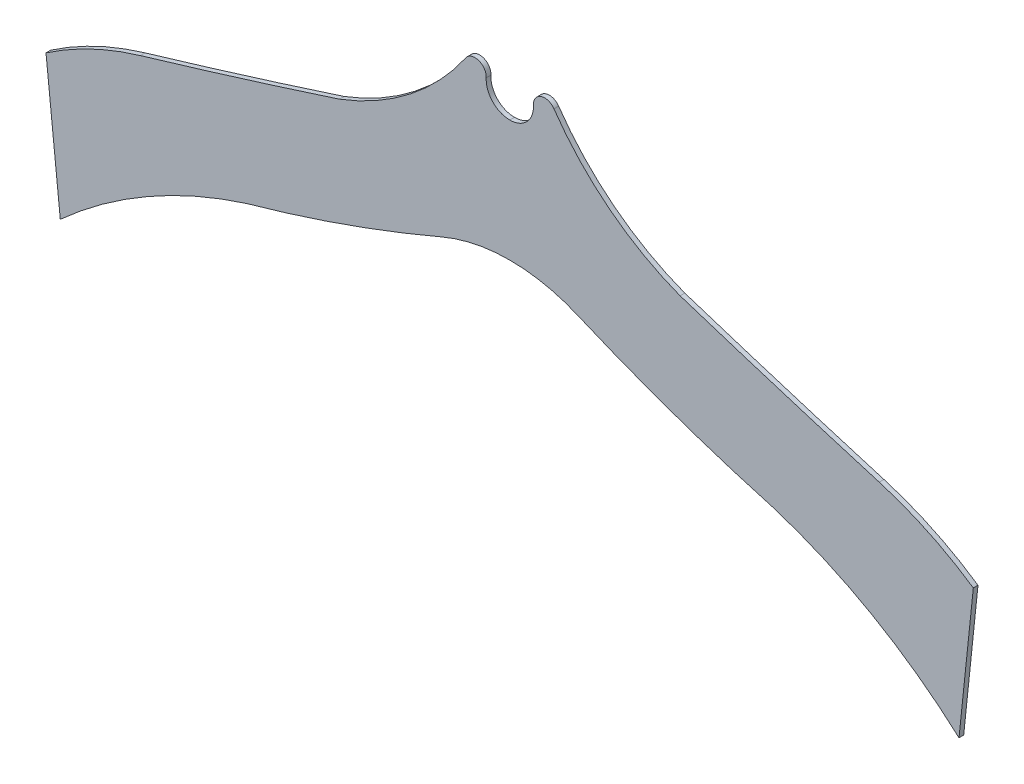
ISO-10303-21;
HEADER;
FILE_DESCRIPTION(('STEP AP214'),'2;1');
FILE_NAME('part.step','',(''),(''),'','','');
FILE_SCHEMA(('AUTOMOTIVE_DESIGN { 1 0 10303 214 1 1 1 1 }'));
ENDSEC;
DATA;
#1=APPLICATION_CONTEXT('core data for automotive mechanical design processes');
#2=APPLICATION_PROTOCOL_DEFINITION('international standard','automotive_design',2000,#1);
#3=PRODUCT_CONTEXT('',#1,'mechanical');
#4=PRODUCT('Part','Part','',(#3));
#5=PRODUCT_RELATED_PRODUCT_CATEGORY('part','',(#4));
#6=PRODUCT_DEFINITION_FORMATION('','',#4);
#7=PRODUCT_DEFINITION_CONTEXT('part definition',#1,'design');
#8=PRODUCT_DEFINITION('design','',#6,#7);
#9=PRODUCT_DEFINITION_SHAPE('','',#8);
#10=(LENGTH_UNIT() NAMED_UNIT(*) SI_UNIT(.MILLI.,.METRE.));
#11=(NAMED_UNIT(*) PLANE_ANGLE_UNIT() SI_UNIT($,.RADIAN.));
#12=(NAMED_UNIT(*) SI_UNIT($,.STERADIAN.) SOLID_ANGLE_UNIT());
#13=UNCERTAINTY_MEASURE_WITH_UNIT(LENGTH_MEASURE(1.E-05),#10,'distance_accuracy_value','');
#14=(GEOMETRIC_REPRESENTATION_CONTEXT(3) GLOBAL_UNCERTAINTY_ASSIGNED_CONTEXT((#13)) GLOBAL_UNIT_ASSIGNED_CONTEXT((#10,
#11,#12)) REPRESENTATION_CONTEXT('',''));
#15=CARTESIAN_POINT('',(0.,0.,0.));
#16=DIRECTION('',(0.,0.,1.));
#17=DIRECTION('',(1.,0.,0.));
#18=AXIS2_PLACEMENT_3D('',#15,#16,#17);
#19=CARTESIAN_POINT('',(-741.128045107195,819.426514046939,0.));
#20=DIRECTION('',(-0.994599825520508,-0.103784329619531,0.));
#21=DIRECTION('',(0.103784329619531,-0.994599825520508,0.));
#22=AXIS2_PLACEMENT_3D('',#19,#20,#21);
#23=PLANE('',#22);
#24=DIRECTION('',(0.,0.,-1.));
#25=VECTOR('',#24,1.);
#26=CARTESIAN_POINT('',(-608.406270583659,-452.490491803614,6.35));
#27=LINE('',#26,#25);
#28=CARTESIAN_POINT('',(-608.406270583659,-452.490491803614,6.35));
#29=VERTEX_POINT('',#28);
#30=CARTESIAN_POINT('',(-608.406270583659,-452.490491803614,0.));
#31=VERTEX_POINT('',#30);
#32=EDGE_CURVE('E252',#29,#31,#27,.T.);
#33=ORIENTED_EDGE('',*,*,#32,.F.);
#34=DIRECTION('',(0.103784329619531,-0.994599825520508,0.));
#35=VECTOR('',#34,1.);
#36=CARTESIAN_POINT('',(-433.648459855304,-2127.25284461701,6.35));
#37=LINE('',#36,#35);
#38=CARTESIAN_POINT('',(-627.762456318267,-266.993711846947,6.35));
#39=VERTEX_POINT('',#38);
#40=EDGE_CURVE('E255',#39,#29,#37,.T.);
#41=ORIENTED_EDGE('',*,*,#40,.F.);
#42=DIRECTION('',(0.,0.,-1.));
#43=VECTOR('',#42,1.);
#44=CARTESIAN_POINT('',(-627.762456318268,-266.993711846947,6.35));
#45=LINE('',#44,#43);
#46=CARTESIAN_POINT('',(-627.762456318267,-266.993711846947,0.));
#47=VERTEX_POINT('',#46);
#48=EDGE_CURVE('E248',#39,#47,#45,.T.);
#49=ORIENTED_EDGE('',*,*,#48,.T.);
#50=DIRECTION('',(0.103784329619531,-0.994599825520508,0.));
#51=VECTOR('',#50,1.);
#52=CARTESIAN_POINT('',(-433.648459855304,-2127.25284461701,0.));
#53=LINE('',#52,#51);
#54=EDGE_CURVE('E243',#47,#31,#53,.T.);
#55=ORIENTED_EDGE('',*,*,#54,.T.);
#56=EDGE_LOOP('',(#33,#41,#49,#55));
#57=FACE_BOUND('',#56,.T.);
#58=ADVANCED_FACE('F36',(#57),#23,.T.);
#59=CARTESIAN_POINT('',(741.128045107195,819.426514046939,0.));
#60=DIRECTION('',(0.994599825520508,-0.103784329619531,0.));
#61=DIRECTION('',(-0.103784329619531,-0.994599825520508,0.));
#62=AXIS2_PLACEMENT_3D('',#59,#60,#61);
#63=PLANE('',#62);
#64=DIRECTION('',(0.,0.,-1.));
#65=VECTOR('',#64,1.);
#66=CARTESIAN_POINT('',(608.451430094389,-452.057713159115,6.35));
#67=LINE('',#66,#65);
#68=CARTESIAN_POINT('',(608.451430094389,-452.057713159115,0.));
#69=VERTEX_POINT('',#68);
#70=CARTESIAN_POINT('',(608.451430094389,-452.057713159115,6.35));
#71=VERTEX_POINT('',#70);
#72=EDGE_CURVE('E251',#69,#71,#67,.F.);
#73=ORIENTED_EDGE('',*,*,#72,.F.);
#74=DIRECTION('',(0.103784329619531,0.994599825520508,0.));
#75=VECTOR('',#74,1.);
#76=CARTESIAN_POINT('',(429.370376525692,-2168.25114319246,0.));
#77=LINE('',#76,#75);
#78=CARTESIAN_POINT('',(627.797282319719,-266.659962666374,0.));
#79=VERTEX_POINT('',#78);
#80=EDGE_CURVE('E247',#69,#79,#77,.T.);
#81=ORIENTED_EDGE('',*,*,#80,.T.);
#82=DIRECTION('',(0.,0.,-1.));
#83=VECTOR('',#82,1.);
#84=CARTESIAN_POINT('',(627.797282319719,-266.659962666374,6.35));
#85=LINE('',#84,#83);
#86=CARTESIAN_POINT('',(627.797282319719,-266.659962666374,6.35));
#87=VERTEX_POINT('',#86);
#88=EDGE_CURVE('E246',#79,#87,#85,.F.);
#89=ORIENTED_EDGE('',*,*,#88,.T.);
#90=DIRECTION('',(0.103784329619531,0.994599825520508,0.));
#91=VECTOR('',#90,1.);
#92=CARTESIAN_POINT('',(429.370376525692,-2168.25114319246,6.35));
#93=LINE('',#92,#91);
#94=EDGE_CURVE('E40',#71,#87,#93,.T.);
#95=ORIENTED_EDGE('',*,*,#94,.F.);
#96=EDGE_LOOP('',(#73,#81,#89,#95));
#97=FACE_BOUND('',#96,.T.);
#98=ADVANCED_FACE('F373',(#97),#63,.T.);
#99=CARTESIAN_POINT('',(-149.626818853529,-960.302602730689,6.35));
#100=DIRECTION('',(0.,0.,-1.));
#101=DIRECTION('',(-1.,0.,0.));
#102=AXIS2_PLACEMENT_3D('',#99,#100,#101);
#103=CYLINDRICAL_SURFACE('',#102,684.362276381457);
#104=CARTESIAN_POINT('',(-149.626818853529,-960.302602730689,6.35));
#105=DIRECTION('',(0.,0.,1.));
#106=DIRECTION('',(1.,0.,0.));
#107=AXIS2_PLACEMENT_3D('',#104,#105,#106);
#108=CIRCLE('',#107,684.362276381457);
#109=CARTESIAN_POINT('',(-356.494214289515,-307.954838083993,6.35));
#110=VERTEX_POINT('',#109);
#111=EDGE_CURVE('E195',#110,#29,#108,.T.);
#112=ORIENTED_EDGE('',*,*,#111,.T.);
#113=ORIENTED_EDGE('',*,*,#32,.T.);
#114=CARTESIAN_POINT('',(-149.626818853529,-960.302602730689,0.));
#115=DIRECTION('',(0.,0.,1.));
#116=DIRECTION('',(1.,0.,0.));
#117=AXIS2_PLACEMENT_3D('',#114,#115,#116);
#118=CIRCLE('',#117,684.362276381457);
#119=CARTESIAN_POINT('',(-356.494214289515,-307.954838083993,0.));
#120=VERTEX_POINT('',#119);
#121=EDGE_CURVE('E234',#120,#31,#118,.T.);
#122=ORIENTED_EDGE('',*,*,#121,.F.);
#123=DIRECTION('',(0.,0.,-1.));
#124=VECTOR('',#123,1.);
#125=CARTESIAN_POINT('',(-356.494214289515,-307.954838083993,6.35));
#126=LINE('',#125,#124);
#127=EDGE_CURVE('E294',#110,#120,#126,.T.);
#128=ORIENTED_EDGE('',*,*,#127,.F.);
#129=EDGE_LOOP('',(#112,#113,#122,#128));
#130=FACE_BOUND('',#129,.T.);
#131=ADVANCED_FACE('F375',(#130),#103,.F.);
#132=CARTESIAN_POINT('',(-931.247662145724,1749.97689497029,6.35));
#133=DIRECTION('',(0.,0.,-1.));
#134=DIRECTION('',(-1.,0.,0.));
#135=AXIS2_PLACEMENT_3D('',#132,#133,#134);
#136=CYLINDRICAL_SURFACE('',#135,2136.68541056806);
#137=CARTESIAN_POINT('',(-931.247662145724,1749.97689497029,0.));
#138=DIRECTION('',(0.,0.,1.));
#139=DIRECTION('',(1.,0.,0.));
#140=AXIS2_PLACEMENT_3D('',#137,#138,#139);
#141=CIRCLE('',#140,2136.68541056806);
#142=CARTESIAN_POINT('',(-91.4193635317043,-214.740126023188,0.));
#143=VERTEX_POINT('',#142);
#144=EDGE_CURVE('E238',#120,#143,#141,.T.);
#145=ORIENTED_EDGE('',*,*,#144,.T.);
#146=DIRECTION('',(0.,0.,-1.));
#147=VECTOR('',#146,1.);
#148=CARTESIAN_POINT('',(-91.4193635317043,-214.740126023188,6.35));
#149=LINE('',#148,#147);
#150=CARTESIAN_POINT('',(-91.4193635317043,-214.740126023188,6.35));
#151=VERTEX_POINT('',#150);
#152=EDGE_CURVE('E297',#151,#143,#149,.T.);
#153=ORIENTED_EDGE('',*,*,#152,.F.);
#154=CARTESIAN_POINT('',(-931.247662145724,1749.97689497029,6.35));
#155=DIRECTION('',(0.,0.,1.));
#156=DIRECTION('',(1.,0.,0.));
#157=AXIS2_PLACEMENT_3D('',#154,#155,#156);
#158=CIRCLE('',#157,2136.68541056806);
#159=EDGE_CURVE('E192',#110,#151,#158,.T.);
#160=ORIENTED_EDGE('',*,*,#159,.F.);
#161=ORIENTED_EDGE('',*,*,#127,.T.);
#162=EDGE_LOOP('',(#145,#153,#160,#161));
#163=FACE_BOUND('',#162,.T.);
#164=ADVANCED_FACE('F381',(#163),#136,.T.);
#165=CARTESIAN_POINT('',(-0.156347124893763,-428.243293300525,6.35));
#166=DIRECTION('',(0.,0.,-1.));
#167=DIRECTION('',(-1.,0.,0.));
#168=AXIS2_PLACEMENT_3D('',#165,#166,#167);
#169=CYLINDRICAL_SURFACE('',#168,232.190741850594);
#170=CARTESIAN_POINT('',(-0.156347124893763,-428.243293300525,0.));
#171=DIRECTION('',(0.,0.,1.));
#172=DIRECTION('',(1.,0.,0.));
#173=AXIS2_PLACEMENT_3D('',#170,#171,#172);
#174=CIRCLE('',#173,232.190741850594);
#175=CARTESIAN_POINT('',(0.262323317295323,-196.052928909171,0.));
#176=VERTEX_POINT('',#175);
#177=EDGE_CURVE('E228',#176,#143,#174,.T.);
#178=ORIENTED_EDGE('',*,*,#177,.F.);
#179=DIRECTION('',(0.,0.,-1.));
#180=VECTOR('',#179,1.);
#181=CARTESIAN_POINT('',(0.262323317295323,-196.052928909171,6.35));
#182=LINE('',#181,#180);
#183=CARTESIAN_POINT('',(0.262323317295323,-196.052928909171,6.35));
#184=VERTEX_POINT('',#183);
#185=EDGE_CURVE('E118',#184,#176,#182,.T.);
#186=ORIENTED_EDGE('',*,*,#185,.F.);
#187=CARTESIAN_POINT('',(-0.156347124893763,-428.243293300525,6.35));
#188=DIRECTION('',(0.,0.,1.));
#189=DIRECTION('',(1.,0.,0.));
#190=AXIS2_PLACEMENT_3D('',#187,#188,#189);
#191=CIRCLE('',#190,232.190741850594);
#192=EDGE_CURVE('E189',#184,#151,#191,.T.);
#193=ORIENTED_EDGE('',*,*,#192,.T.);
#194=ORIENTED_EDGE('',*,*,#152,.T.);
#195=EDGE_LOOP('',(#178,#186,#193,#194));
#196=FACE_BOUND('',#195,.T.);
#197=ADVANCED_FACE('F418',(#196),#169,.F.);
#198=CARTESIAN_POINT('',(0.680993759012427,-428.243293300527,6.35));
#199=DIRECTION('',(0.,0.,-1.));
#200=DIRECTION('',(-1.,0.,0.));
#201=AXIS2_PLACEMENT_3D('',#198,#199,#200);
#202=CYLINDRICAL_SURFACE('',#201,232.19074185057);
#203=CARTESIAN_POINT('',(0.680993759012427,-428.243293300527,0.));
#204=DIRECTION('',(0.,0.,1.));
#205=DIRECTION('',(1.,0.,0.));
#206=AXIS2_PLACEMENT_3D('',#203,#204,#205);
#207=CIRCLE('',#206,232.19074185057);
#208=CARTESIAN_POINT('',(91.9440101658601,-214.740126023264,0.));
#209=VERTEX_POINT('',#208);
#210=EDGE_CURVE('E309',#209,#176,#207,.T.);
#211=ORIENTED_EDGE('',*,*,#210,.F.);
#212=DIRECTION('',(0.,0.,-1.));
#213=VECTOR('',#212,1.);
#214=CARTESIAN_POINT('',(91.9440101658601,-214.740126023264,6.35));
#215=LINE('',#214,#213);
#216=CARTESIAN_POINT('',(91.9440101658601,-214.740126023264,6.35));
#217=VERTEX_POINT('',#216);
#218=EDGE_CURVE('E295',#217,#209,#215,.T.);
#219=ORIENTED_EDGE('',*,*,#218,.F.);
#220=CARTESIAN_POINT('',(0.680993759012427,-428.243293300527,6.35));
#221=DIRECTION('',(0.,0.,1.));
#222=DIRECTION('',(1.,0.,0.));
#223=AXIS2_PLACEMENT_3D('',#220,#221,#222);
#224=CIRCLE('',#223,232.19074185057);
#225=EDGE_CURVE('E199',#217,#184,#224,.T.);
#226=ORIENTED_EDGE('',*,*,#225,.T.);
#227=ORIENTED_EDGE('',*,*,#185,.T.);
#228=EDGE_LOOP('',(#211,#219,#226,#227));
#229=FACE_BOUND('',#228,.T.);
#230=ADVANCED_FACE('F415',(#229),#202,.F.);
#231=CARTESIAN_POINT('',(931.772308779785,1749.9768949703,6.35));
#232=DIRECTION('',(0.,0.,-1.));
#233=DIRECTION('',(-1.,0.,0.));
#234=AXIS2_PLACEMENT_3D('',#231,#232,#233);
#235=CYLINDRICAL_SURFACE('',#234,2136.68541056811);
#236=CARTESIAN_POINT('',(931.772308779785,1749.9768949703,0.));
#237=DIRECTION('',(0.,0.,1.));
#238=DIRECTION('',(1.,0.,0.));
#239=AXIS2_PLACEMENT_3D('',#236,#237,#238);
#240=CIRCLE('',#239,2136.68541056811);
#241=CARTESIAN_POINT('',(357.018860927798,-307.954838085206,0.));
#242=VERTEX_POINT('',#241);
#243=EDGE_CURVE('E262',#209,#242,#240,.T.);
#244=ORIENTED_EDGE('',*,*,#243,.T.);
#245=DIRECTION('',(0.,0.,-1.));
#246=VECTOR('',#245,1.);
#247=CARTESIAN_POINT('',(357.018860927798,-307.954838085206,6.35));
#248=LINE('',#247,#246);
#249=CARTESIAN_POINT('',(357.018860927798,-307.954838085206,6.35));
#250=VERTEX_POINT('',#249);
#251=EDGE_CURVE('E291',#250,#242,#248,.T.);
#252=ORIENTED_EDGE('',*,*,#251,.F.);
#253=CARTESIAN_POINT('',(931.772308779785,1749.9768949703,6.35));
#254=DIRECTION('',(0.,0.,1.));
#255=DIRECTION('',(1.,0.,0.));
#256=AXIS2_PLACEMENT_3D('',#253,#254,#255);
#257=CIRCLE('',#256,2136.68541056811);
#258=EDGE_CURVE('E196',#217,#250,#257,.T.);
#259=ORIENTED_EDGE('',*,*,#258,.F.);
#260=ORIENTED_EDGE('',*,*,#218,.T.);
#261=EDGE_LOOP('',(#244,#252,#259,#260));
#262=FACE_BOUND('',#261,.T.);
#263=ADVANCED_FACE('F292',(#262),#235,.T.);
#264=CARTESIAN_POINT('',(150.151465487733,-960.302602730623,6.35));
#265=DIRECTION('',(0.,0.,-1.));
#266=DIRECTION('',(-1.,0.,0.));
#267=AXIS2_PLACEMENT_3D('',#264,#265,#266);
#268=CYLINDRICAL_SURFACE('',#267,684.362276381462);
#269=CARTESIAN_POINT('',(150.151465487733,-960.302602730623,0.));
#270=DIRECTION('',(0.,0.,1.));
#271=DIRECTION('',(1.,0.,0.));
#272=AXIS2_PLACEMENT_3D('',#269,#270,#271);
#273=CIRCLE('',#272,684.362276381462);
#274=EDGE_CURVE('E237',#69,#242,#273,.T.);
#275=ORIENTED_EDGE('',*,*,#274,.F.);
#276=ORIENTED_EDGE('',*,*,#72,.T.);
#277=CARTESIAN_POINT('',(150.151465487733,-960.302602730623,6.35));
#278=DIRECTION('',(0.,0.,1.));
#279=DIRECTION('',(1.,0.,0.));
#280=AXIS2_PLACEMENT_3D('',#277,#278,#279);
#281=CIRCLE('',#280,684.362276381462);
#282=EDGE_CURVE('E200',#71,#250,#281,.T.);
#283=ORIENTED_EDGE('',*,*,#282,.T.);
#284=ORIENTED_EDGE('',*,*,#251,.T.);
#285=EDGE_LOOP('',(#275,#276,#283,#284));
#286=FACE_BOUND('',#285,.T.);
#287=ADVANCED_FACE('F274',(#286),#268,.F.);
#288=CARTESIAN_POINT('',(370.600209775842,-644.656663544559,6.35));
#289=DIRECTION('',(0.,0.,-1.));
#290=DIRECTION('',(-1.,0.,0.));
#291=AXIS2_PLACEMENT_3D('',#288,#289,#290);
#292=CYLINDRICAL_SURFACE('',#291,457.199999999926);
#293=ORIENTED_EDGE('',*,*,#88,.F.);
#294=CARTESIAN_POINT('',(370.600209775842,-644.656663544559,0.));
#295=DIRECTION('',(0.,0.,1.));
#296=DIRECTION('',(1.,0.,0.));
#297=AXIS2_PLACEMENT_3D('',#294,#295,#296);
#298=CIRCLE('',#297,457.199999999926);
#299=CARTESIAN_POINT('',(500.458599124062,-206.286228049988,0.));
#300=VERTEX_POINT('',#299);
#301=EDGE_CURVE('E233',#79,#300,#298,.T.);
#302=ORIENTED_EDGE('',*,*,#301,.T.);
#303=DIRECTION('',(0.,0.,-1.));
#304=VECTOR('',#303,1.);
#305=CARTESIAN_POINT('',(500.458599124062,-206.286228049988,6.35));
#306=LINE('',#305,#304);
#307=CARTESIAN_POINT('',(500.458599124062,-206.286228049988,6.35));
#308=VERTEX_POINT('',#307);
#309=EDGE_CURVE('E338',#308,#300,#306,.T.);
#310=ORIENTED_EDGE('',*,*,#309,.F.);
#311=CARTESIAN_POINT('',(370.600209775842,-644.656663544559,6.35));
#312=DIRECTION('',(0.,0.,1.));
#313=DIRECTION('',(1.,0.,0.));
#314=AXIS2_PLACEMENT_3D('',#311,#312,#313);
#315=CIRCLE('',#314,457.199999999926);
#316=EDGE_CURVE('E213',#87,#308,#315,.T.);
#317=ORIENTED_EDGE('',*,*,#316,.F.);
#318=EDGE_LOOP('',(#293,#302,#310,#317));
#319=FACE_BOUND('',#318,.T.);
#320=ADVANCED_FACE('F372',(#319),#292,.T.);
#321=CARTESIAN_POINT('',(3590.22888950069,10224.029090722,6.35));
#322=DIRECTION('',(0.,0.,-1.));
#323=DIRECTION('',(-1.,0.,0.));
#324=AXIS2_PLACEMENT_3D('',#321,#322,#323);
#325=CYLINDRICAL_SURFACE('',#324,10878.334343837);
#326=CARTESIAN_POINT('',(3590.22888950069,10224.029090722,0.));
#327=DIRECTION('',(0.,0.,1.));
#328=DIRECTION('',(1.,0.,0.));
#329=AXIS2_PLACEMENT_3D('',#326,#327,#328);
#330=CIRCLE('',#329,10878.334343837);
#331=CARTESIAN_POINT('',(230.806507684277,-122.585783566876,0.));
#332=VERTEX_POINT('',#331);
#333=EDGE_CURVE('E260',#332,#300,#330,.T.);
#334=ORIENTED_EDGE('',*,*,#333,.F.);
#335=DIRECTION('',(0.,0.,-1.));
#336=VECTOR('',#335,1.);
#337=CARTESIAN_POINT('',(230.806507684277,-122.585783566876,6.35));
#338=LINE('',#337,#336);
#339=CARTESIAN_POINT('',(230.806507684277,-122.585783566876,6.35));
#340=VERTEX_POINT('',#339);
#341=EDGE_CURVE('E341',#340,#332,#338,.T.);
#342=ORIENTED_EDGE('',*,*,#341,.F.);
#343=CARTESIAN_POINT('',(3590.22888950069,10224.029090722,6.35));
#344=DIRECTION('',(0.,0.,1.));
#345=DIRECTION('',(1.,0.,0.));
#346=AXIS2_PLACEMENT_3D('',#343,#344,#345);
#347=CIRCLE('',#346,10878.334343837);
#348=EDGE_CURVE('E210',#340,#308,#347,.T.);
#349=ORIENTED_EDGE('',*,*,#348,.T.);
#350=ORIENTED_EDGE('',*,*,#309,.T.);
#351=EDGE_LOOP('',(#334,#342,#349,#350));
#352=FACE_BOUND('',#351,.T.);
#353=ADVANCED_FACE('F363',(#352),#325,.F.);
#354=CARTESIAN_POINT('',(359.750331869882,217.914087955783,6.35));
#355=DIRECTION('',(0.,0.,-1.));
#356=DIRECTION('',(-1.,0.,0.));
#357=AXIS2_PLACEMENT_3D('',#354,#355,#356);
#358=CYLINDRICAL_SURFACE('',#357,364.097064397059);
#359=CARTESIAN_POINT('',(359.750331869882,217.914087955783,0.));
#360=DIRECTION('',(0.,0.,1.));
#361=DIRECTION('',(1.,0.,0.));
#362=AXIS2_PLACEMENT_3D('',#359,#360,#361);
#363=CIRCLE('',#362,364.097064397059);
#364=CARTESIAN_POINT('',(59.9897816229322,11.2494203945345,0.));
#365=VERTEX_POINT('',#364);
#366=EDGE_CURVE('E317',#365,#332,#363,.T.);
#367=ORIENTED_EDGE('',*,*,#366,.F.);
#368=DIRECTION('',(0.,0.,-1.));
#369=VECTOR('',#368,1.);
#370=CARTESIAN_POINT('',(59.9897816229322,11.2494203945345,6.35));
#371=LINE('',#370,#369);
#372=CARTESIAN_POINT('',(59.9897816229322,11.2494203945345,6.35));
#373=VERTEX_POINT('',#372);
#374=EDGE_CURVE('E343',#373,#365,#371,.T.);
#375=ORIENTED_EDGE('',*,*,#374,.F.);
#376=CARTESIAN_POINT('',(359.750331869882,217.914087955783,6.35));
#377=DIRECTION('',(0.,0.,1.));
#378=DIRECTION('',(1.,0.,0.));
#379=AXIS2_PLACEMENT_3D('',#376,#377,#378);
#380=CIRCLE('',#379,364.097064397059);
#381=EDGE_CURVE('E207',#373,#340,#380,.T.);
#382=ORIENTED_EDGE('',*,*,#381,.T.);
#383=ORIENTED_EDGE('',*,*,#341,.T.);
#384=EDGE_LOOP('',(#367,#375,#382,#383));
#385=FACE_BOUND('',#384,.T.);
#386=ADVANCED_FACE('F358',(#385),#358,.F.);
#387=CARTESIAN_POINT('',(47.4427131830861,2.59906354837725,6.35));
#388=DIRECTION('',(0.,0.,-1.));
#389=DIRECTION('',(-1.,0.,0.));
#390=AXIS2_PLACEMENT_3D('',#387,#388,#389);
#391=CYLINDRICAL_SURFACE('',#390,15.2399999999964);
#392=CARTESIAN_POINT('',(47.4427131830861,2.59906354837725,0.));
#393=DIRECTION('',(0.,0.,1.));
#394=DIRECTION('',(1.,0.,0.));
#395=AXIS2_PLACEMENT_3D('',#392,#393,#394);
#396=CIRCLE('',#395,15.2399999999964);
#397=CARTESIAN_POINT('',(32.2260429510726,1.756124019181,0.));
#398=VERTEX_POINT('',#397);
#399=EDGE_CURVE('E314',#365,#398,#396,.T.);
#400=ORIENTED_EDGE('',*,*,#399,.T.);
#401=DIRECTION('',(0.,0.,-1.));
#402=VECTOR('',#401,1.);
#403=CARTESIAN_POINT('',(32.2260429510726,1.756124019181,6.35));
#404=LINE('',#403,#402);
#405=CARTESIAN_POINT('',(32.2260429510726,1.756124019181,6.35));
#406=VERTEX_POINT('',#405);
#407=EDGE_CURVE('E345',#406,#398,#404,.T.);
#408=ORIENTED_EDGE('',*,*,#407,.F.);
#409=CARTESIAN_POINT('',(47.4427131830861,2.59906354837725,6.35));
#410=DIRECTION('',(0.,0.,1.));
#411=DIRECTION('',(1.,0.,0.));
#412=AXIS2_PLACEMENT_3D('',#409,#410,#411);
#413=CIRCLE('',#412,15.2399999999964);
#414=EDGE_CURVE('E205',#373,#406,#413,.T.);
#415=ORIENTED_EDGE('',*,*,#414,.F.);
#416=ORIENTED_EDGE('',*,*,#374,.T.);
#417=EDGE_LOOP('',(#400,#408,#415,#416));
#418=FACE_BOUND('',#417,.T.);
#419=ADVANCED_FACE('F355',(#418),#391,.T.);
#420=CARTESIAN_POINT('',(0.524646634117776,0.,6.35));
#421=DIRECTION('',(0.,0.,-1.));
#422=DIRECTION('',(-1.,0.,0.));
#423=AXIS2_PLACEMENT_3D('',#420,#421,#422);
#424=CYLINDRICAL_SURFACE('',#423,31.7500000002422);
#425=CARTESIAN_POINT('',(0.524646634117776,0.,0.));
#426=DIRECTION('',(0.,0.,1.));
#427=DIRECTION('',(1.,0.,0.));
#428=AXIS2_PLACEMENT_3D('',#425,#426,#427);
#429=CIRCLE('',#428,31.7500000002422);
#430=CARTESIAN_POINT('',(0.298037308666715,-31.7491913003938,0.));
#431=VERTEX_POINT('',#430);
#432=EDGE_CURVE('E311',#431,#398,#429,.T.);
#433=ORIENTED_EDGE('',*,*,#432,.F.);
#434=DIRECTION('',(0.,0.,-1.));
#435=VECTOR('',#434,1.);
#436=CARTESIAN_POINT('',(0.298037308666715,-31.7491913003938,6.35));
#437=LINE('',#436,#435);
#438=CARTESIAN_POINT('',(0.298037308666715,-31.7491913003938,6.35));
#439=VERTEX_POINT('',#438);
#440=EDGE_CURVE('E193',#439,#431,#437,.T.);
#441=ORIENTED_EDGE('',*,*,#440,.F.);
#442=CARTESIAN_POINT('',(0.524646634117776,0.,6.35));
#443=DIRECTION('',(0.,0.,1.));
#444=DIRECTION('',(1.,0.,0.));
#445=AXIS2_PLACEMENT_3D('',#442,#443,#444);
#446=CIRCLE('',#445,31.7500000002422);
#447=EDGE_CURVE('E202',#439,#406,#446,.T.);
#448=ORIENTED_EDGE('',*,*,#447,.T.);
#449=ORIENTED_EDGE('',*,*,#407,.T.);
#450=EDGE_LOOP('',(#433,#441,#448,#449));
#451=FACE_BOUND('',#450,.T.);
#452=ADVANCED_FACE('F351',(#451),#424,.F.);
#453=CARTESIAN_POINT('',(0.0714279831250941,0.,6.35));
#454=DIRECTION('',(0.,0.,-1.));
#455=DIRECTION('',(-1.,0.,0.));
#456=AXIS2_PLACEMENT_3D('',#453,#454,#455);
#457=CYLINDRICAL_SURFACE('',#456,31.7500000002425);
#458=CARTESIAN_POINT('',(0.0714279831250941,0.,0.));
#459=DIRECTION('',(0.,0.,1.));
#460=DIRECTION('',(1.,0.,0.));
#461=AXIS2_PLACEMENT_3D('',#458,#459,#460);
#462=CIRCLE('',#461,31.7500000002425);
#463=CARTESIAN_POINT('',(0.262323317068858,-31.749426120591,0.));
#464=VERTEX_POINT('',#463);
#465=EDGE_CURVE('E11',#464,#431,#462,.T.);
#466=ORIENTED_EDGE('',*,*,#465,.F.);
#467=DIRECTION('',(0.,0.,-1.));
#468=VECTOR('',#467,1.);
#469=CARTESIAN_POINT('',(0.262323317068858,-31.749426120591,6.35));
#470=LINE('',#469,#468);
#471=CARTESIAN_POINT('',(0.262323317068858,-31.749426120591,6.35));
#472=VERTEX_POINT('',#471);
#473=EDGE_CURVE('E55',#472,#464,#470,.T.);
#474=ORIENTED_EDGE('',*,*,#473,.F.);
#475=CARTESIAN_POINT('',(0.0714279831250941,0.,6.35));
#476=DIRECTION('',(0.,0.,1.));
#477=DIRECTION('',(1.,0.,0.));
#478=AXIS2_PLACEMENT_3D('',#475,#476,#477);
#479=CIRCLE('',#478,31.7500000002425);
#480=EDGE_CURVE('E226',#472,#439,#479,.T.);
#481=ORIENTED_EDGE('',*,*,#480,.T.);
#482=ORIENTED_EDGE('',*,*,#440,.T.);
#483=EDGE_LOOP('',(#466,#474,#481,#482));
#484=FACE_BOUND('',#483,.T.);
#485=ADVANCED_FACE('F346',(#484),#457,.F.);
#486=CARTESIAN_POINT('',(0.453218650990017,0.,6.35));
#487=DIRECTION('',(0.,0.,-1.));
#488=DIRECTION('',(-1.,0.,0.));
#489=AXIS2_PLACEMENT_3D('',#486,#487,#488);
#490=CYLINDRICAL_SURFACE('',#489,31.7500000002422);
#491=CARTESIAN_POINT('',(0.453218650990017,0.,0.));
#492=DIRECTION('',(0.,0.,1.));
#493=DIRECTION('',(1.,0.,0.));
#494=AXIS2_PLACEMENT_3D('',#491,#492,#493);
#495=CIRCLE('',#494,31.7500000002422);
#496=CARTESIAN_POINT('',(0.226609325508322,-31.7491913003936,0.));
#497=VERTEX_POINT('',#496);
#498=EDGE_CURVE('E46',#497,#464,#495,.T.);
#499=ORIENTED_EDGE('',*,*,#498,.F.);
#500=DIRECTION('',(0.,0.,-1.));
#501=VECTOR('',#500,1.);
#502=CARTESIAN_POINT('',(0.226609325508322,-31.7491913003936,6.35));
#503=LINE('',#502,#501);
#504=CARTESIAN_POINT('',(0.226609325508322,-31.7491913003936,6.35));
#505=VERTEX_POINT('',#504);
#506=EDGE_CURVE('E106',#505,#497,#503,.T.);
#507=ORIENTED_EDGE('',*,*,#506,.F.);
#508=CARTESIAN_POINT('',(0.453218650990017,0.,6.35));
#509=DIRECTION('',(0.,0.,1.));
#510=DIRECTION('',(1.,0.,0.));
#511=AXIS2_PLACEMENT_3D('',#508,#509,#510);
#512=CIRCLE('',#511,31.7500000002422);
#513=EDGE_CURVE('E224',#505,#472,#512,.T.);
#514=ORIENTED_EDGE('',*,*,#513,.T.);
#515=ORIENTED_EDGE('',*,*,#473,.T.);
#516=EDGE_LOOP('',(#499,#507,#514,#515));
#517=FACE_BOUND('',#516,.T.);
#518=ADVANCED_FACE('F442',(#517),#490,.F.);
#519=CARTESIAN_POINT('',(0.,0.,6.35));
#520=DIRECTION('',(0.,0.,-1.));
#521=DIRECTION('',(-1.,0.,0.));
#522=AXIS2_PLACEMENT_3D('',#519,#520,#521);
#523=CYLINDRICAL_SURFACE('',#522,31.7500000002424);
#524=CARTESIAN_POINT('',(0.,0.,0.));
#525=DIRECTION('',(0.,0.,1.));
#526=DIRECTION('',(1.,0.,0.));
#527=AXIS2_PLACEMENT_3D('',#524,#525,#526);
#528=CIRCLE('',#527,31.7500000002424);
#529=CARTESIAN_POINT('',(-31.701396316955,1.75612401918103,0.));
#530=VERTEX_POINT('',#529);
#531=EDGE_CURVE('E179',#530,#497,#528,.T.);
#532=ORIENTED_EDGE('',*,*,#531,.F.);
#533=DIRECTION('',(0.,0.,-1.));
#534=VECTOR('',#533,1.);
#535=CARTESIAN_POINT('',(-31.701396316955,1.75612401918103,6.35));
#536=LINE('',#535,#534);
#537=CARTESIAN_POINT('',(-31.701396316955,1.75612401918103,6.35));
#538=VERTEX_POINT('',#537);
#539=EDGE_CURVE('E161',#538,#530,#536,.T.);
#540=ORIENTED_EDGE('',*,*,#539,.F.);
#541=CARTESIAN_POINT('',(0.,0.,6.35));
#542=DIRECTION('',(0.,0.,1.));
#543=DIRECTION('',(1.,0.,0.));
#544=AXIS2_PLACEMENT_3D('',#541,#542,#543);
#545=CIRCLE('',#544,31.7500000002424);
#546=EDGE_CURVE('E222',#538,#505,#545,.T.);
#547=ORIENTED_EDGE('',*,*,#546,.T.);
#548=ORIENTED_EDGE('',*,*,#506,.T.);
#549=EDGE_LOOP('',(#532,#540,#547,#548));
#550=FACE_BOUND('',#549,.T.);
#551=ADVANCED_FACE('F184',(#550),#523,.F.);
#552=CARTESIAN_POINT('',(-46.9180665489684,2.59906354837725,6.35));
#553=DIRECTION('',(0.,0.,-1.));
#554=DIRECTION('',(-1.,0.,0.));
#555=AXIS2_PLACEMENT_3D('',#552,#553,#554);
#556=CYLINDRICAL_SURFACE('',#555,15.2399999999967);
#557=CARTESIAN_POINT('',(-46.9180665489684,2.59906354837725,0.));
#558=DIRECTION('',(0.,0.,1.));
#559=DIRECTION('',(1.,0.,0.));
#560=AXIS2_PLACEMENT_3D('',#557,#558,#559);
#561=CIRCLE('',#560,15.2399999999967);
#562=CARTESIAN_POINT('',(-59.4651349888153,11.2494203945345,0.));
#563=VERTEX_POINT('',#562);
#564=EDGE_CURVE('E165',#530,#563,#561,.T.);
#565=ORIENTED_EDGE('',*,*,#564,.T.);
#566=DIRECTION('',(0.,0.,-1.));
#567=VECTOR('',#566,1.);
#568=CARTESIAN_POINT('',(-59.4651349888153,11.2494203945345,6.35));
#569=LINE('',#568,#567);
#570=CARTESIAN_POINT('',(-59.4651349888153,11.2494203945345,6.35));
#571=VERTEX_POINT('',#570);
#572=EDGE_CURVE('E172',#571,#563,#569,.T.);
#573=ORIENTED_EDGE('',*,*,#572,.F.);
#574=CARTESIAN_POINT('',(-46.9180665489684,2.59906354837725,6.35));
#575=DIRECTION('',(0.,0.,1.));
#576=DIRECTION('',(1.,0.,0.));
#577=AXIS2_PLACEMENT_3D('',#574,#575,#576);
#578=CIRCLE('',#577,15.2399999999967);
#579=EDGE_CURVE('E167',#538,#571,#578,.T.);
#580=ORIENTED_EDGE('',*,*,#579,.F.);
#581=ORIENTED_EDGE('',*,*,#539,.T.);
#582=EDGE_LOOP('',(#565,#573,#580,#581));
#583=FACE_BOUND('',#582,.T.);
#584=ADVANCED_FACE('F163',(#583),#556,.T.);
#585=CARTESIAN_POINT('',(-359.225685235765,217.914087955783,6.35));
#586=DIRECTION('',(0.,0.,-1.));
#587=DIRECTION('',(-1.,0.,0.));
#588=AXIS2_PLACEMENT_3D('',#585,#586,#587);
#589=CYLINDRICAL_SURFACE('',#588,364.097064397058);
#590=CARTESIAN_POINT('',(-359.225685235765,217.914087955783,0.));
#591=DIRECTION('',(0.,0.,1.));
#592=DIRECTION('',(1.,0.,0.));
#593=AXIS2_PLACEMENT_3D('',#590,#591,#592);
#594=CIRCLE('',#593,364.097064397058);
#595=CARTESIAN_POINT('',(-230.281861050161,-122.585783566876,0.));
#596=VERTEX_POINT('',#595);
#597=EDGE_CURVE('E182',#596,#563,#594,.T.);
#598=ORIENTED_EDGE('',*,*,#597,.F.);
#599=DIRECTION('',(0.,0.,-1.));
#600=VECTOR('',#599,1.);
#601=CARTESIAN_POINT('',(-230.281861050161,-122.585783566876,6.35));
#602=LINE('',#601,#600);
#603=CARTESIAN_POINT('',(-230.281861050161,-122.585783566876,6.35));
#604=VERTEX_POINT('',#603);
#605=EDGE_CURVE('E328',#604,#596,#602,.T.);
#606=ORIENTED_EDGE('',*,*,#605,.F.);
#607=CARTESIAN_POINT('',(-359.225685235765,217.914087955783,6.35));
#608=DIRECTION('',(0.,0.,1.));
#609=DIRECTION('',(1.,0.,0.));
#610=AXIS2_PLACEMENT_3D('',#607,#608,#609);
#611=CIRCLE('',#610,364.097064397058);
#612=EDGE_CURVE('E217',#604,#571,#611,.T.);
#613=ORIENTED_EDGE('',*,*,#612,.T.);
#614=ORIENTED_EDGE('',*,*,#572,.T.);
#615=EDGE_LOOP('',(#598,#606,#613,#614));
#616=FACE_BOUND('',#615,.T.);
#617=ADVANCED_FACE('F333',(#616),#589,.F.);
#618=CARTESIAN_POINT('',(-3589.70424286657,10224.029090722,6.35));
#619=DIRECTION('',(0.,0.,-1.));
#620=DIRECTION('',(-1.,0.,0.));
#621=AXIS2_PLACEMENT_3D('',#618,#619,#620);
#622=CYLINDRICAL_SURFACE('',#621,10878.334343837);
#623=CARTESIAN_POINT('',(-3589.70424286657,10224.029090722,0.));
#624=DIRECTION('',(0.,0.,1.));
#625=DIRECTION('',(1.,0.,0.));
#626=AXIS2_PLACEMENT_3D('',#623,#624,#625);
#627=CIRCLE('',#626,10878.334343837);
#628=CARTESIAN_POINT('',(-499.933952489967,-206.286228049994,0.));
#629=VERTEX_POINT('',#628);
#630=EDGE_CURVE('E232',#629,#596,#627,.T.);
#631=ORIENTED_EDGE('',*,*,#630,.F.);
#632=DIRECTION('',(0.,0.,-1.));
#633=VECTOR('',#632,1.);
#634=CARTESIAN_POINT('',(-499.933952489967,-206.286228049994,6.35));
#635=LINE('',#634,#633);
#636=CARTESIAN_POINT('',(-499.933952489967,-206.286228049994,6.35));
#637=VERTEX_POINT('',#636);
#638=EDGE_CURVE('E326',#637,#629,#635,.T.);
#639=ORIENTED_EDGE('',*,*,#638,.F.);
#640=CARTESIAN_POINT('',(-3589.70424286657,10224.029090722,6.35));
#641=DIRECTION('',(0.,0.,1.));
#642=DIRECTION('',(1.,0.,0.));
#643=AXIS2_PLACEMENT_3D('',#640,#641,#642);
#644=CIRCLE('',#643,10878.334343837);
#645=EDGE_CURVE('E214',#637,#604,#644,.T.);
#646=ORIENTED_EDGE('',*,*,#645,.T.);
#647=ORIENTED_EDGE('',*,*,#605,.T.);
#648=EDGE_LOOP('',(#631,#639,#646,#647));
#649=FACE_BOUND('',#648,.T.);
#650=ADVANCED_FACE('F325',(#649),#622,.F.);
#651=CARTESIAN_POINT('',(-370.075563141724,-644.656663544563,6.35));
#652=DIRECTION('',(0.,0.,-1.));
#653=DIRECTION('',(-1.,0.,0.));
#654=AXIS2_PLACEMENT_3D('',#651,#652,#653);
#655=CYLINDRICAL_SURFACE('',#654,457.199999999929);
#656=ORIENTED_EDGE('',*,*,#48,.F.);
#657=CARTESIAN_POINT('',(-370.075563141724,-644.656663544563,6.35));
#658=DIRECTION('',(0.,0.,1.));
#659=DIRECTION('',(1.,0.,0.));
#660=AXIS2_PLACEMENT_3D('',#657,#658,#659);
#661=CIRCLE('',#660,457.199999999929);
#662=EDGE_CURVE('E218',#637,#39,#661,.T.);
#663=ORIENTED_EDGE('',*,*,#662,.F.);
#664=ORIENTED_EDGE('',*,*,#638,.T.);
#665=CARTESIAN_POINT('',(-370.075563141724,-644.656663544563,0.));
#666=DIRECTION('',(0.,0.,1.));
#667=DIRECTION('',(1.,0.,0.));
#668=AXIS2_PLACEMENT_3D('',#665,#666,#667);
#669=CIRCLE('',#668,457.199999999929);
#670=EDGE_CURVE('E229',#629,#47,#669,.T.);
#671=ORIENTED_EDGE('',*,*,#670,.T.);
#672=EDGE_LOOP('',(#656,#663,#664,#671));
#673=FACE_BOUND('',#672,.T.);
#674=ADVANCED_FACE('F392',(#673),#655,.T.);
#675=CARTESIAN_POINT('',(-198.589222338844,-2102.72492418051,0.));
#676=DIRECTION('',(0.,0.,1.));
#677=DIRECTION('',(1.,0.,0.));
#678=AXIS2_PLACEMENT_3D('',#675,#676,#677);
#679=PLANE('',#678);
#680=ORIENTED_EDGE('',*,*,#54,.F.);
#681=ORIENTED_EDGE('',*,*,#670,.F.);
#682=ORIENTED_EDGE('',*,*,#630,.T.);
#683=ORIENTED_EDGE('',*,*,#597,.T.);
#684=ORIENTED_EDGE('',*,*,#564,.F.);
#685=ORIENTED_EDGE('',*,*,#531,.T.);
#686=ORIENTED_EDGE('',*,*,#498,.T.);
#687=ORIENTED_EDGE('',*,*,#465,.T.);
#688=ORIENTED_EDGE('',*,*,#432,.T.);
#689=ORIENTED_EDGE('',*,*,#399,.F.);
#690=ORIENTED_EDGE('',*,*,#366,.T.);
#691=ORIENTED_EDGE('',*,*,#333,.T.);
#692=ORIENTED_EDGE('',*,*,#301,.F.);
#693=ORIENTED_EDGE('',*,*,#80,.F.);
#694=ORIENTED_EDGE('',*,*,#274,.T.);
#695=ORIENTED_EDGE('',*,*,#243,.F.);
#696=ORIENTED_EDGE('',*,*,#210,.T.);
#697=ORIENTED_EDGE('',*,*,#177,.T.);
#698=ORIENTED_EDGE('',*,*,#144,.F.);
#699=ORIENTED_EDGE('',*,*,#121,.T.);
#700=EDGE_LOOP('',(#680,#681,#682,#683,#684,#685,#686,#687,#688,#689,#690,#691,#692,#693,#694,
#695,#696,#697,#698,#699));
#701=FACE_BOUND('',#700,.T.);
#702=ADVANCED_FACE('F177',(#701),#679,.F.);
#703=CARTESIAN_POINT('',(-198.589222338844,-2102.72492418051,6.35));
#704=DIRECTION('',(0.,0.,1.));
#705=DIRECTION('',(1.,0.,0.));
#706=AXIS2_PLACEMENT_3D('',#703,#704,#705);
#707=PLANE('',#706);
#708=ORIENTED_EDGE('',*,*,#662,.T.);
#709=ORIENTED_EDGE('',*,*,#40,.T.);
#710=ORIENTED_EDGE('',*,*,#111,.F.);
#711=ORIENTED_EDGE('',*,*,#159,.T.);
#712=ORIENTED_EDGE('',*,*,#192,.F.);
#713=ORIENTED_EDGE('',*,*,#225,.F.);
#714=ORIENTED_EDGE('',*,*,#258,.T.);
#715=ORIENTED_EDGE('',*,*,#282,.F.);
#716=ORIENTED_EDGE('',*,*,#94,.T.);
#717=ORIENTED_EDGE('',*,*,#316,.T.);
#718=ORIENTED_EDGE('',*,*,#348,.F.);
#719=ORIENTED_EDGE('',*,*,#381,.F.);
#720=ORIENTED_EDGE('',*,*,#414,.T.);
#721=ORIENTED_EDGE('',*,*,#447,.F.);
#722=ORIENTED_EDGE('',*,*,#480,.F.);
#723=ORIENTED_EDGE('',*,*,#513,.F.);
#724=ORIENTED_EDGE('',*,*,#546,.F.);
#725=ORIENTED_EDGE('',*,*,#579,.T.);
#726=ORIENTED_EDGE('',*,*,#612,.F.);
#727=ORIENTED_EDGE('',*,*,#645,.F.);
#728=EDGE_LOOP('',(#708,#709,#710,#711,#712,#713,#714,#715,#716,#717,#718,#719,#720,#721,#722,
#723,#724,#725,#726,#727));
#729=FACE_BOUND('',#728,.T.);
#730=ADVANCED_FACE('F38',(#729),#707,.T.);
#731=CLOSED_SHELL('',(#58,#98,#131,#164,#197,#230,#263,#287,#320,#353,#386,#419,#452,#485,#518,
#551,#584,#617,#650,#674,#702,#730));
#732=MANIFOLD_SOLID_BREP('B2',#731);
#733=ADVANCED_BREP_SHAPE_REPRESENTATION('',(#18,#732),#14);
#734=SHAPE_DEFINITION_REPRESENTATION(#9,#733);
ENDSEC;
END-ISO-10303-21;
